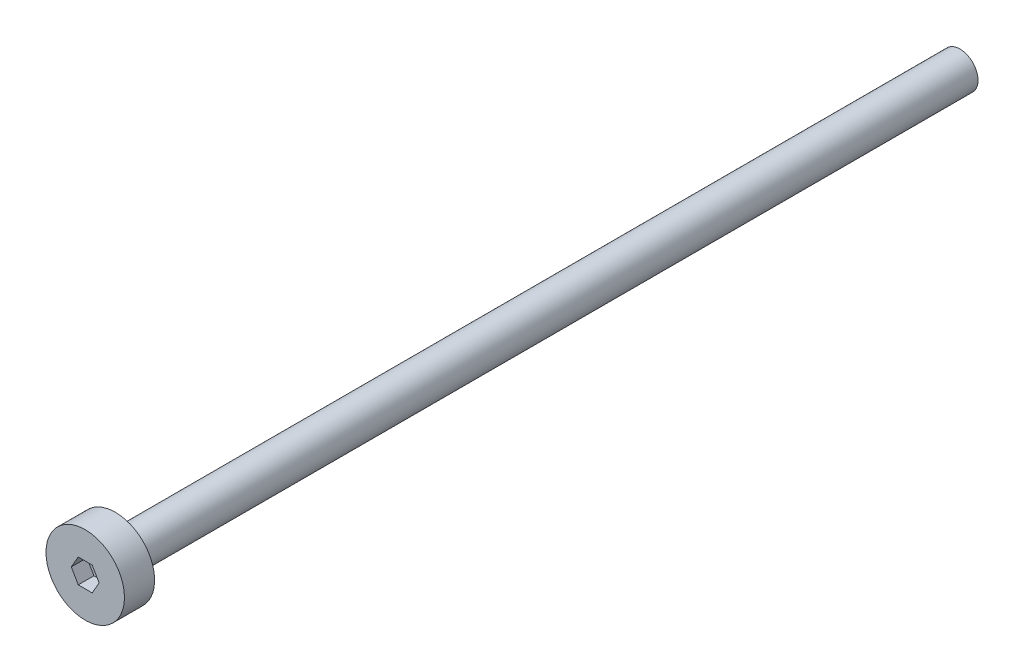
ISO-10303-21;
HEADER;
FILE_DESCRIPTION(('STEP AP214'),'2;1');
FILE_NAME('part.step','',(''),(''),'','','');
FILE_SCHEMA(('AUTOMOTIVE_DESIGN { 1 0 10303 214 1 1 1 1 }'));
ENDSEC;
DATA;
#1=APPLICATION_CONTEXT('core data for automotive mechanical design processes');
#2=APPLICATION_PROTOCOL_DEFINITION('international standard','automotive_design',2000,#1);
#3=PRODUCT_CONTEXT('',#1,'mechanical');
#4=PRODUCT('Part','Part','',(#3));
#5=PRODUCT_RELATED_PRODUCT_CATEGORY('part','',(#4));
#6=PRODUCT_DEFINITION_FORMATION('','',#4);
#7=PRODUCT_DEFINITION_CONTEXT('part definition',#1,'design');
#8=PRODUCT_DEFINITION('design','',#6,#7);
#9=PRODUCT_DEFINITION_SHAPE('','',#8);
#10=(LENGTH_UNIT() NAMED_UNIT(*) SI_UNIT(.MILLI.,.METRE.));
#11=(NAMED_UNIT(*) PLANE_ANGLE_UNIT() SI_UNIT($,.RADIAN.));
#12=(NAMED_UNIT(*) SI_UNIT($,.STERADIAN.) SOLID_ANGLE_UNIT());
#13=UNCERTAINTY_MEASURE_WITH_UNIT(LENGTH_MEASURE(1.E-05),#10,'distance_accuracy_value','');
#14=(GEOMETRIC_REPRESENTATION_CONTEXT(3) GLOBAL_UNCERTAINTY_ASSIGNED_CONTEXT((#13)) GLOBAL_UNIT_ASSIGNED_CONTEXT((#10,
#11,#12)) REPRESENTATION_CONTEXT('',''));
#15=CARTESIAN_POINT('',(0.,0.,0.));
#16=DIRECTION('',(0.,0.,1.));
#17=DIRECTION('',(1.,0.,0.));
#18=AXIS2_PLACEMENT_3D('',#15,#16,#17);
#19=CARTESIAN_POINT('',(0.,0.,1.2));
#20=DIRECTION('',(0.,0.,1.));
#21=DIRECTION('',(1.,0.,0.));
#22=AXIS2_PLACEMENT_3D('',#19,#20,#21);
#23=PLANE('',#22);
#24=DIRECTION('',(-0.50000000000019,0.866025403784329,0.));
#25=VECTOR('',#24,1.);
#26=CARTESIAN_POINT('',(1.154700538379,0.,1.2));
#27=LINE('',#26,#25);
#28=CARTESIAN_POINT('',(1.154700538379,0.,1.2));
#29=VERTEX_POINT('',#28);
#30=CARTESIAN_POINT('',(0.57735026919,1.,1.2));
#31=VERTEX_POINT('',#30);
#32=EDGE_CURVE('E9',#29,#31,#27,.T.);
#33=ORIENTED_EDGE('',*,*,#32,.T.);
#34=DIRECTION('',(-1.,0.,0.));
#35=VECTOR('',#34,1.);
#36=CARTESIAN_POINT('',(0.57735026919,1.,1.2));
#37=LINE('',#36,#35);
#38=CARTESIAN_POINT('',(-0.57735026919,1.,1.2));
#39=VERTEX_POINT('',#38);
#40=EDGE_CURVE('E151',#31,#39,#37,.T.);
#41=ORIENTED_EDGE('',*,*,#40,.T.);
#42=DIRECTION('',(-0.50000000000019,-0.866025403784329,0.));
#43=VECTOR('',#42,1.);
#44=CARTESIAN_POINT('',(-0.57735026919,1.,1.2));
#45=LINE('',#44,#43);
#46=CARTESIAN_POINT('',(-1.154700538379,0.,1.2));
#47=VERTEX_POINT('',#46);
#48=EDGE_CURVE('E145',#39,#47,#45,.T.);
#49=ORIENTED_EDGE('',*,*,#48,.T.);
#50=DIRECTION('',(0.50000000000019,-0.866025403784329,0.));
#51=VECTOR('',#50,1.);
#52=CARTESIAN_POINT('',(-1.154700538379,0.,1.2));
#53=LINE('',#52,#51);
#54=CARTESIAN_POINT('',(-0.57735026919,-1.,1.2));
#55=VERTEX_POINT('',#54);
#56=EDGE_CURVE('E110',#47,#55,#53,.T.);
#57=ORIENTED_EDGE('',*,*,#56,.T.);
#58=DIRECTION('',(1.,0.,0.));
#59=VECTOR('',#58,1.);
#60=CARTESIAN_POINT('',(-0.57735026919,-1.,1.2));
#61=LINE('',#60,#59);
#62=CARTESIAN_POINT('',(0.57735026919,-1.,1.2));
#63=VERTEX_POINT('',#62);
#64=EDGE_CURVE('E106',#55,#63,#61,.T.);
#65=ORIENTED_EDGE('',*,*,#64,.T.);
#66=DIRECTION('',(0.50000000000019,0.866025403784329,0.));
#67=VECTOR('',#66,1.);
#68=CARTESIAN_POINT('',(0.57735026919,-1.,1.2));
#69=LINE('',#68,#67);
#70=EDGE_CURVE('E139',#63,#29,#69,.T.);
#71=ORIENTED_EDGE('',*,*,#70,.T.);
#72=EDGE_LOOP('',(#33,#41,#49,#57,#65,#71));
#73=FACE_BOUND('',#72,.T.);
#74=ADVANCED_FACE('F14',(#73),#23,.T.);
#75=CARTESIAN_POINT('',(0.,0.,-70.));
#76=DIRECTION('',(0.,0.,-1.));
#77=DIRECTION('',(0.,-1.,0.));
#78=AXIS2_PLACEMENT_3D('',#75,#76,#77);
#79=PLANE('',#78);
#80=CARTESIAN_POINT('',(0.,0.,-70.));
#81=DIRECTION('',(0.,0.,-1.));
#82=DIRECTION('',(-1.,0.,0.));
#83=AXIS2_PLACEMENT_3D('',#80,#81,#82);
#84=CIRCLE('',#83,1.5);
#85=CARTESIAN_POINT('',(-1.5,0.,-70.));
#86=VERTEX_POINT('',#85);
#87=EDGE_CURVE('E158',#86,#86,#84,.T.);
#88=ORIENTED_EDGE('',*,*,#87,.T.);
#89=EDGE_LOOP('',(#88));
#90=FACE_BOUND('',#89,.T.);
#91=ADVANCED_FACE('F225',(#90),#79,.T.);
#92=CARTESIAN_POINT('',(1.154700538379,0.,1.2));
#93=DIRECTION('',(-0.866025403784329,-0.50000000000019,0.));
#94=DIRECTION('',(-0.50000000000019,0.866025403784329,0.));
#95=AXIS2_PLACEMENT_3D('',#92,#93,#94);
#96=PLANE('',#95);
#97=ORIENTED_EDGE('',*,*,#32,.F.);
#98=DIRECTION('',(0.,0.,1.));
#99=VECTOR('',#98,1.);
#100=CARTESIAN_POINT('',(1.154700538379,0.,1.2));
#101=LINE('',#100,#99);
#102=CARTESIAN_POINT('',(1.154700538379,0.,2.5));
#103=VERTEX_POINT('',#102);
#104=EDGE_CURVE('E144',#29,#103,#101,.T.);
#105=ORIENTED_EDGE('',*,*,#104,.T.);
#106=DIRECTION('',(-0.50000000000019,0.866025403784329,0.));
#107=VECTOR('',#106,1.);
#108=CARTESIAN_POINT('',(1.010362971082,0.25,2.5));
#109=LINE('',#108,#107);
#110=CARTESIAN_POINT('',(0.57735026919,1.,2.5));
#111=VERTEX_POINT('',#110);
#112=EDGE_CURVE('E17',#103,#111,#109,.T.);
#113=ORIENTED_EDGE('',*,*,#112,.T.);
#114=DIRECTION('',(0.,0.,1.));
#115=VECTOR('',#114,1.);
#116=CARTESIAN_POINT('',(0.57735026919,1.,1.2));
#117=LINE('',#116,#115);
#118=EDGE_CURVE('E24',#31,#111,#117,.T.);
#119=ORIENTED_EDGE('',*,*,#118,.F.);
#120=EDGE_LOOP('',(#97,#105,#113,#119));
#121=FACE_BOUND('',#120,.T.);
#122=ADVANCED_FACE('F202',(#121),#96,.T.);
#123=CARTESIAN_POINT('',(0.57735026919,1.,1.2));
#124=DIRECTION('',(0.,-1.,0.));
#125=DIRECTION('',(-1.,0.,0.));
#126=AXIS2_PLACEMENT_3D('',#123,#124,#125);
#127=PLANE('',#126);
#128=ORIENTED_EDGE('',*,*,#40,.F.);
#129=ORIENTED_EDGE('',*,*,#118,.T.);
#130=DIRECTION('',(-1.,0.,0.));
#131=VECTOR('',#130,1.);
#132=CARTESIAN_POINT('',(0.288675134595,1.,2.5));
#133=LINE('',#132,#131);
#134=CARTESIAN_POINT('',(-0.57735026919,1.,2.5));
#135=VERTEX_POINT('',#134);
#136=EDGE_CURVE('E171',#111,#135,#133,.T.);
#137=ORIENTED_EDGE('',*,*,#136,.T.);
#138=DIRECTION('',(0.,0.,1.));
#139=VECTOR('',#138,1.);
#140=CARTESIAN_POINT('',(-0.57735026919,1.,1.2));
#141=LINE('',#140,#139);
#142=EDGE_CURVE('E148',#39,#135,#141,.T.);
#143=ORIENTED_EDGE('',*,*,#142,.F.);
#144=EDGE_LOOP('',(#128,#129,#137,#143));
#145=FACE_BOUND('',#144,.T.);
#146=ADVANCED_FACE('F208',(#145),#127,.T.);
#147=CARTESIAN_POINT('',(-0.57735026919,1.,1.2));
#148=DIRECTION('',(0.866025403784329,-0.50000000000019,0.));
#149=DIRECTION('',(0.,0.,-1.));
#150=AXIS2_PLACEMENT_3D('',#147,#148,#149);
#151=PLANE('',#150);
#152=ORIENTED_EDGE('',*,*,#48,.F.);
#153=ORIENTED_EDGE('',*,*,#142,.T.);
#154=DIRECTION('',(-0.50000000000019,-0.866025403784329,0.));
#155=VECTOR('',#154,1.);
#156=CARTESIAN_POINT('',(-0.721687836487,0.75,2.5));
#157=LINE('',#156,#155);
#158=CARTESIAN_POINT('',(-1.154700538379,0.,2.5));
#159=VERTEX_POINT('',#158);
#160=EDGE_CURVE('E121',#135,#159,#157,.T.);
#161=ORIENTED_EDGE('',*,*,#160,.T.);
#162=DIRECTION('',(0.,0.,1.));
#163=VECTOR('',#162,1.);
#164=CARTESIAN_POINT('',(-1.154700538379,0.,1.2));
#165=LINE('',#164,#163);
#166=EDGE_CURVE('E116',#47,#159,#165,.T.);
#167=ORIENTED_EDGE('',*,*,#166,.F.);
#168=EDGE_LOOP('',(#152,#153,#161,#167));
#169=FACE_BOUND('',#168,.T.);
#170=ADVANCED_FACE('F207',(#169),#151,.T.);
#171=CARTESIAN_POINT('',(-1.154700538379,0.,1.2));
#172=DIRECTION('',(0.866025403784329,0.50000000000019,0.));
#173=DIRECTION('',(0.,0.,-1.));
#174=AXIS2_PLACEMENT_3D('',#171,#172,#173);
#175=PLANE('',#174);
#176=ORIENTED_EDGE('',*,*,#56,.F.);
#177=ORIENTED_EDGE('',*,*,#166,.T.);
#178=DIRECTION('',(0.50000000000019,-0.866025403784329,0.));
#179=VECTOR('',#178,1.);
#180=CARTESIAN_POINT('',(-1.010362971082,-0.25,2.5));
#181=LINE('',#180,#179);
#182=CARTESIAN_POINT('',(-0.57735026919,-1.,2.5));
#183=VERTEX_POINT('',#182);
#184=EDGE_CURVE('E113',#159,#183,#181,.T.);
#185=ORIENTED_EDGE('',*,*,#184,.T.);
#186=DIRECTION('',(0.,0.,1.));
#187=VECTOR('',#186,1.);
#188=CARTESIAN_POINT('',(-0.57735026919,-1.,1.2));
#189=LINE('',#188,#187);
#190=EDGE_CURVE('E100',#55,#183,#189,.T.);
#191=ORIENTED_EDGE('',*,*,#190,.F.);
#192=EDGE_LOOP('',(#176,#177,#185,#191));
#193=FACE_BOUND('',#192,.T.);
#194=ADVANCED_FACE('F114',(#193),#175,.T.);
#195=CARTESIAN_POINT('',(-0.57735026919,-1.,1.2));
#196=DIRECTION('',(0.,1.,0.));
#197=DIRECTION('',(1.,0.,0.));
#198=AXIS2_PLACEMENT_3D('',#195,#196,#197);
#199=PLANE('',#198);
#200=ORIENTED_EDGE('',*,*,#64,.F.);
#201=ORIENTED_EDGE('',*,*,#190,.T.);
#202=DIRECTION('',(1.,0.,0.));
#203=VECTOR('',#202,1.);
#204=CARTESIAN_POINT('',(-0.288675134595,-1.,2.5));
#205=LINE('',#204,#203);
#206=CARTESIAN_POINT('',(0.57735026919,-1.,2.5));
#207=VERTEX_POINT('',#206);
#208=EDGE_CURVE('E105',#183,#207,#205,.T.);
#209=ORIENTED_EDGE('',*,*,#208,.T.);
#210=DIRECTION('',(0.,0.,1.));
#211=VECTOR('',#210,1.);
#212=CARTESIAN_POINT('',(0.57735026919,-1.,1.2));
#213=LINE('',#212,#211);
#214=EDGE_CURVE('E141',#63,#207,#213,.T.);
#215=ORIENTED_EDGE('',*,*,#214,.F.);
#216=EDGE_LOOP('',(#200,#201,#209,#215));
#217=FACE_BOUND('',#216,.T.);
#218=ADVANCED_FACE('F102',(#217),#199,.T.);
#219=CARTESIAN_POINT('',(0.57735026919,-1.,1.2));
#220=DIRECTION('',(-0.866025403784329,0.50000000000019,0.));
#221=DIRECTION('',(0.,0.,1.));
#222=AXIS2_PLACEMENT_3D('',#219,#220,#221);
#223=PLANE('',#222);
#224=ORIENTED_EDGE('',*,*,#70,.F.);
#225=ORIENTED_EDGE('',*,*,#214,.T.);
#226=DIRECTION('',(0.50000000000019,0.866025403784329,0.));
#227=VECTOR('',#226,1.);
#228=CARTESIAN_POINT('',(0.721687836487,-0.75,2.5));
#229=LINE('',#228,#227);
#230=EDGE_CURVE('E128',#207,#103,#229,.T.);
#231=ORIENTED_EDGE('',*,*,#230,.T.);
#232=ORIENTED_EDGE('',*,*,#104,.F.);
#233=EDGE_LOOP('',(#224,#225,#231,#232));
#234=FACE_BOUND('',#233,.T.);
#235=ADVANCED_FACE('F211',(#234),#223,.T.);
#236=CARTESIAN_POINT('',(0.,0.,0.));
#237=DIRECTION('',(0.,0.,-1.));
#238=DIRECTION('',(-1.,0.,0.));
#239=AXIS2_PLACEMENT_3D('',#236,#237,#238);
#240=CYLINDRICAL_SURFACE('',#239,1.5);
#241=ORIENTED_EDGE('',*,*,#87,.F.);
#242=DIRECTION('',(0.,0.,-1.));
#243=VECTOR('',#242,1.);
#244=CARTESIAN_POINT('',(-1.5,0.,0.));
#245=LINE('',#244,#243);
#246=CARTESIAN_POINT('',(-1.5,0.,0.));
#247=VERTEX_POINT('',#246);
#248=EDGE_CURVE('E91',#247,#86,#245,.T.);
#249=ORIENTED_EDGE('',*,*,#248,.F.);
#250=CARTESIAN_POINT('',(0.,0.,0.));
#251=DIRECTION('',(0.,0.,-1.));
#252=DIRECTION('',(-1.,0.,0.));
#253=AXIS2_PLACEMENT_3D('',#250,#251,#252);
#254=CIRCLE('',#253,1.5);
#255=EDGE_CURVE('E130',#247,#247,#254,.T.);
#256=ORIENTED_EDGE('',*,*,#255,.T.);
#257=ORIENTED_EDGE('',*,*,#248,.T.);
#258=EDGE_LOOP('',(#241,#249,#256,#257));
#259=FACE_BOUND('',#258,.T.);
#260=ADVANCED_FACE('F213',(#259),#240,.T.);
#261=CARTESIAN_POINT('',(0.,0.,2.5));
#262=DIRECTION('',(0.,0.,-1.));
#263=DIRECTION('',(0.,-1.,0.));
#264=AXIS2_PLACEMENT_3D('',#261,#262,#263);
#265=PLANE('',#264);
#266=ORIENTED_EDGE('',*,*,#208,.F.);
#267=ORIENTED_EDGE('',*,*,#184,.F.);
#268=ORIENTED_EDGE('',*,*,#160,.F.);
#269=ORIENTED_EDGE('',*,*,#136,.F.);
#270=ORIENTED_EDGE('',*,*,#112,.F.);
#271=ORIENTED_EDGE('',*,*,#230,.F.);
#272=EDGE_LOOP('',(#266,#267,#268,#269,#270,#271));
#273=FACE_BOUND('',#272,.T.);
#274=CARTESIAN_POINT('',(0.,0.,2.5));
#275=DIRECTION('',(0.,0.,-1.));
#276=DIRECTION('',(-1.,0.,0.));
#277=AXIS2_PLACEMENT_3D('',#274,#275,#276);
#278=CIRCLE('',#277,3.25);
#279=CARTESIAN_POINT('',(-3.25,0.,2.5));
#280=VERTEX_POINT('',#279);
#281=EDGE_CURVE('E135',#280,#280,#278,.T.);
#282=ORIENTED_EDGE('',*,*,#281,.F.);
#283=EDGE_LOOP('',(#282));
#284=FACE_BOUND('',#283,.T.);
#285=ADVANCED_FACE('F124',(#273,#284),#265,.F.);
#286=CARTESIAN_POINT('',(0.,0.,0.));
#287=DIRECTION('',(0.,0.,-1.));
#288=DIRECTION('',(0.,-1.,0.));
#289=AXIS2_PLACEMENT_3D('',#286,#287,#288);
#290=PLANE('',#289);
#291=ORIENTED_EDGE('',*,*,#255,.F.);
#292=EDGE_LOOP('',(#291));
#293=FACE_BOUND('',#292,.T.);
#294=CARTESIAN_POINT('',(0.,0.,0.));
#295=DIRECTION('',(0.,0.,-1.));
#296=DIRECTION('',(-1.,0.,0.));
#297=AXIS2_PLACEMENT_3D('',#294,#295,#296);
#298=CIRCLE('',#297,3.25);
#299=CARTESIAN_POINT('',(-3.25,0.,0.));
#300=VERTEX_POINT('',#299);
#301=EDGE_CURVE('E175',#300,#300,#298,.T.);
#302=ORIENTED_EDGE('',*,*,#301,.T.);
#303=EDGE_LOOP('',(#302));
#304=FACE_BOUND('',#303,.T.);
#305=ADVANCED_FACE('F182',(#293,#304),#290,.T.);
#306=CARTESIAN_POINT('',(0.,0.,2.5));
#307=DIRECTION('',(0.,0.,-1.));
#308=DIRECTION('',(-1.,0.,0.));
#309=AXIS2_PLACEMENT_3D('',#306,#307,#308);
#310=CYLINDRICAL_SURFACE('',#309,3.25);
#311=ORIENTED_EDGE('',*,*,#301,.F.);
#312=DIRECTION('',(0.,0.,-1.));
#313=VECTOR('',#312,1.);
#314=CARTESIAN_POINT('',(-3.25,0.,2.5));
#315=LINE('',#314,#313);
#316=EDGE_CURVE('E172',#280,#300,#315,.T.);
#317=ORIENTED_EDGE('',*,*,#316,.F.);
#318=ORIENTED_EDGE('',*,*,#281,.T.);
#319=ORIENTED_EDGE('',*,*,#316,.T.);
#320=EDGE_LOOP('',(#311,#317,#318,#319));
#321=FACE_BOUND('',#320,.T.);
#322=ADVANCED_FACE('F185',(#321),#310,.T.);
#323=CLOSED_SHELL('',(#74,#91,#122,#146,#170,#194,#218,#235,#260,#285,#305,#322));
#324=MANIFOLD_SOLID_BREP('B1',#323);
#325=ADVANCED_BREP_SHAPE_REPRESENTATION('',(#18,#324),#14);
#326=SHAPE_DEFINITION_REPRESENTATION(#9,#325);
ENDSEC;
END-ISO-10303-21;
